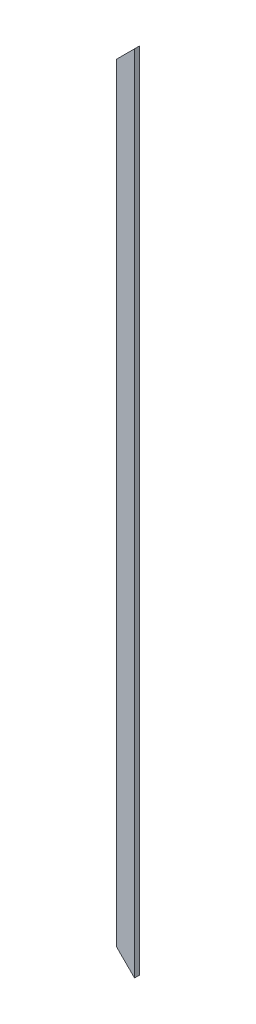
ISO-10303-21;
HEADER;
FILE_DESCRIPTION(('STEP AP214'),'2;1');
FILE_NAME('part.step','',(''),(''),'','','');
FILE_SCHEMA(('AUTOMOTIVE_DESIGN { 1 0 10303 214 1 1 1 1 }'));
ENDSEC;
DATA;
#1=APPLICATION_CONTEXT('core data for automotive mechanical design processes');
#2=APPLICATION_PROTOCOL_DEFINITION('international standard','automotive_design',2000,#1);
#3=PRODUCT_CONTEXT('',#1,'mechanical');
#4=PRODUCT('Part','Part','',(#3));
#5=PRODUCT_RELATED_PRODUCT_CATEGORY('part','',(#4));
#6=PRODUCT_DEFINITION_FORMATION('','',#4);
#7=PRODUCT_DEFINITION_CONTEXT('part definition',#1,'design');
#8=PRODUCT_DEFINITION('design','',#6,#7);
#9=PRODUCT_DEFINITION_SHAPE('','',#8);
#10=(LENGTH_UNIT() NAMED_UNIT(*) SI_UNIT(.MILLI.,.METRE.));
#11=(NAMED_UNIT(*) PLANE_ANGLE_UNIT() SI_UNIT($,.RADIAN.));
#12=(NAMED_UNIT(*) SI_UNIT($,.STERADIAN.) SOLID_ANGLE_UNIT());
#13=UNCERTAINTY_MEASURE_WITH_UNIT(LENGTH_MEASURE(1.E-05),#10,'distance_accuracy_value','');
#14=(GEOMETRIC_REPRESENTATION_CONTEXT(3) GLOBAL_UNCERTAINTY_ASSIGNED_CONTEXT((#13)) GLOBAL_UNIT_ASSIGNED_CONTEXT((#10,
#11,#12)) REPRESENTATION_CONTEXT('',''));
#15=CARTESIAN_POINT('',(0.,0.,0.));
#16=DIRECTION('',(0.,0.,1.));
#17=DIRECTION('',(1.,0.,0.));
#18=AXIS2_PLACEMENT_3D('',#15,#16,#17);
#19=CARTESIAN_POINT('',(-69.85,6273.8,19.05));
#20=DIRECTION('',(-1.,0.,0.));
#21=DIRECTION('',(0.,0.,1.));
#22=AXIS2_PLACEMENT_3D('',#19,#20,#21);
#23=PLANE('',#22);
#24=DIRECTION('',(0.,0.,1.));
#25=VECTOR('',#24,1.);
#26=CARTESIAN_POINT('',(-69.85,6134.1,-19.05));
#27=LINE('',#26,#25);
#28=CARTESIAN_POINT('',(-69.85,6134.1,-19.05));
#29=VERTEX_POINT('',#28);
#30=CARTESIAN_POINT('',(-69.85,6134.1,19.05));
#31=VERTEX_POINT('',#30);
#32=EDGE_CURVE('E78',#29,#31,#27,.T.);
#33=ORIENTED_EDGE('',*,*,#32,.F.);
#34=DIRECTION('',(0.,-1.,0.));
#35=VECTOR('',#34,1.);
#36=CARTESIAN_POINT('',(-69.85,6273.8,-19.05));
#37=LINE('',#36,#35);
#38=CARTESIAN_POINT('',(-69.8500000000007,139.700000000001,-19.05));
#39=VERTEX_POINT('',#38);
#40=EDGE_CURVE('E42',#29,#39,#37,.T.);
#41=ORIENTED_EDGE('',*,*,#40,.T.);
#42=DIRECTION('',(0.,0.,1.));
#43=VECTOR('',#42,1.);
#44=CARTESIAN_POINT('',(-69.8500000000007,139.700000000001,-19.05));
#45=LINE('',#44,#43);
#46=CARTESIAN_POINT('',(-69.8500000000007,139.700000000001,19.05));
#47=VERTEX_POINT('',#46);
#48=EDGE_CURVE('E112',#39,#47,#45,.T.);
#49=ORIENTED_EDGE('',*,*,#48,.T.);
#50=DIRECTION('',(0.,-1.,0.));
#51=VECTOR('',#50,1.);
#52=CARTESIAN_POINT('',(-69.85,6273.8,19.05));
#53=LINE('',#52,#51);
#54=EDGE_CURVE('E11',#31,#47,#53,.T.);
#55=ORIENTED_EDGE('',*,*,#54,.F.);
#56=EDGE_LOOP('',(#33,#41,#49,#55));
#57=FACE_BOUND('',#56,.T.);
#58=ADVANCED_FACE('F39',(#57),#23,.T.);
#59=CARTESIAN_POINT('',(-69.85,6273.8,19.05));
#60=DIRECTION('',(0.,0.,-1.));
#61=DIRECTION('',(-1.,0.,0.));
#62=AXIS2_PLACEMENT_3D('',#59,#60,#61);
#63=PLANE('',#62);
#64=DIRECTION('',(0.,-1.,0.));
#65=VECTOR('',#64,1.);
#66=CARTESIAN_POINT('',(69.85,6273.8,19.05));
#67=LINE('',#66,#65);
#68=CARTESIAN_POINT('',(69.85,6273.8,19.05));
#69=VERTEX_POINT('',#68);
#70=CARTESIAN_POINT('',(69.85,0.,19.05));
#71=VERTEX_POINT('',#70);
#72=EDGE_CURVE('E48',#69,#71,#67,.T.);
#73=ORIENTED_EDGE('',*,*,#72,.F.);
#74=DIRECTION('',(-0.707106781186547,-0.707106781186549,0.));
#75=VECTOR('',#74,1.);
#76=CARTESIAN_POINT('',(2.08166817117217E-13,6203.95,19.05));
#77=LINE('',#76,#75);
#78=EDGE_CURVE('E55',#69,#31,#77,.T.);
#79=ORIENTED_EDGE('',*,*,#78,.T.);
#80=ORIENTED_EDGE('',*,*,#54,.T.);
#81=DIRECTION('',(0.707106781186546,-0.707106781186548,0.));
#82=VECTOR('',#81,1.);
#83=CARTESIAN_POINT('',(-3136.9,3206.75000000001,19.05));
#84=LINE('',#83,#82);
#85=EDGE_CURVE('E91',#47,#71,#84,.T.);
#86=ORIENTED_EDGE('',*,*,#85,.T.);
#87=EDGE_LOOP('',(#73,#79,#80,#86));
#88=FACE_BOUND('',#87,.T.);
#89=ADVANCED_FACE('F108',(#88),#63,.F.);
#90=CARTESIAN_POINT('',(69.85,6273.8,19.05));
#91=DIRECTION('',(-1.,0.,0.));
#92=DIRECTION('',(0.,0.,1.));
#93=AXIS2_PLACEMENT_3D('',#90,#91,#92);
#94=PLANE('',#93);
#95=DIRECTION('',(0.,0.,-1.));
#96=VECTOR('',#95,1.);
#97=CARTESIAN_POINT('',(69.85,0.,19.05));
#98=LINE('',#97,#96);
#99=CARTESIAN_POINT('',(69.85,0.,-19.05));
#100=VERTEX_POINT('',#99);
#101=EDGE_CURVE('E96',#71,#100,#98,.T.);
#102=ORIENTED_EDGE('',*,*,#101,.T.);
#103=DIRECTION('',(0.,-1.,0.));
#104=VECTOR('',#103,1.);
#105=CARTESIAN_POINT('',(69.85,6273.8,-19.05));
#106=LINE('',#105,#104);
#107=CARTESIAN_POINT('',(69.85,6273.8,-19.05));
#108=VERTEX_POINT('',#107);
#109=EDGE_CURVE('E95',#108,#100,#106,.T.);
#110=ORIENTED_EDGE('',*,*,#109,.F.);
#111=DIRECTION('',(0.,0.,-1.));
#112=VECTOR('',#111,1.);
#113=CARTESIAN_POINT('',(69.85,6273.8,19.05));
#114=LINE('',#113,#112);
#115=EDGE_CURVE('E80',#69,#108,#114,.T.);
#116=ORIENTED_EDGE('',*,*,#115,.F.);
#117=ORIENTED_EDGE('',*,*,#72,.T.);
#118=EDGE_LOOP('',(#102,#110,#116,#117));
#119=FACE_BOUND('',#118,.T.);
#120=ADVANCED_FACE('F105',(#119),#94,.F.);
#121=CARTESIAN_POINT('',(-69.85,6273.8,-19.05));
#122=DIRECTION('',(0.,0.,-1.));
#123=DIRECTION('',(-1.,0.,0.));
#124=AXIS2_PLACEMENT_3D('',#121,#122,#123);
#125=PLANE('',#124);
#126=DIRECTION('',(0.707106781186547,0.707106781186549,0.));
#127=VECTOR('',#126,1.);
#128=CARTESIAN_POINT('',(69.85,6273.8,-19.05));
#129=LINE('',#128,#127);
#130=EDGE_CURVE('E75',#29,#108,#129,.T.);
#131=ORIENTED_EDGE('',*,*,#130,.T.);
#132=ORIENTED_EDGE('',*,*,#109,.T.);
#133=DIRECTION('',(-0.707106781186546,0.707106781186548,0.));
#134=VECTOR('',#133,1.);
#135=CARTESIAN_POINT('',(69.85,0.,-19.05));
#136=LINE('',#135,#134);
#137=EDGE_CURVE('E85',#100,#39,#136,.T.);
#138=ORIENTED_EDGE('',*,*,#137,.T.);
#139=ORIENTED_EDGE('',*,*,#40,.F.);
#140=EDGE_LOOP('',(#131,#132,#138,#139));
#141=FACE_BOUND('',#140,.T.);
#142=ADVANCED_FACE('F94',(#141),#125,.T.);
#143=CARTESIAN_POINT('',(69.85,0.,-19.05));
#144=DIRECTION('',(0.707106781186548,0.707106781186546,0.));
#145=DIRECTION('',(-0.707106781186547,0.707106781186549,0.));
#146=AXIS2_PLACEMENT_3D('',#143,#144,#145);
#147=PLANE('',#146);
#148=ORIENTED_EDGE('',*,*,#48,.F.);
#149=ORIENTED_EDGE('',*,*,#137,.F.);
#150=ORIENTED_EDGE('',*,*,#101,.F.);
#151=ORIENTED_EDGE('',*,*,#85,.F.);
#152=EDGE_LOOP('',(#148,#149,#150,#151));
#153=FACE_BOUND('',#152,.T.);
#154=ADVANCED_FACE('F113',(#153),#147,.F.);
#155=CARTESIAN_POINT('',(69.85,6273.8,-19.05));
#156=DIRECTION('',(0.707106781186549,-0.707106781186547,0.));
#157=DIRECTION('',(0.707106781186547,0.707106781186549,0.));
#158=AXIS2_PLACEMENT_3D('',#155,#156,#157);
#159=PLANE('',#158);
#160=ORIENTED_EDGE('',*,*,#115,.T.);
#161=ORIENTED_EDGE('',*,*,#130,.F.);
#162=ORIENTED_EDGE('',*,*,#32,.T.);
#163=ORIENTED_EDGE('',*,*,#78,.F.);
#164=EDGE_LOOP('',(#160,#161,#162,#163));
#165=FACE_BOUND('',#164,.T.);
#166=ADVANCED_FACE('F77',(#165),#159,.F.);
#167=CLOSED_SHELL('',(#58,#89,#120,#142,#154,#166));
#168=MANIFOLD_SOLID_BREP('B2',#167);
#169=ADVANCED_BREP_SHAPE_REPRESENTATION('',(#18,#168),#14);
#170=SHAPE_DEFINITION_REPRESENTATION(#9,#169);
ENDSEC;
END-ISO-10303-21;
